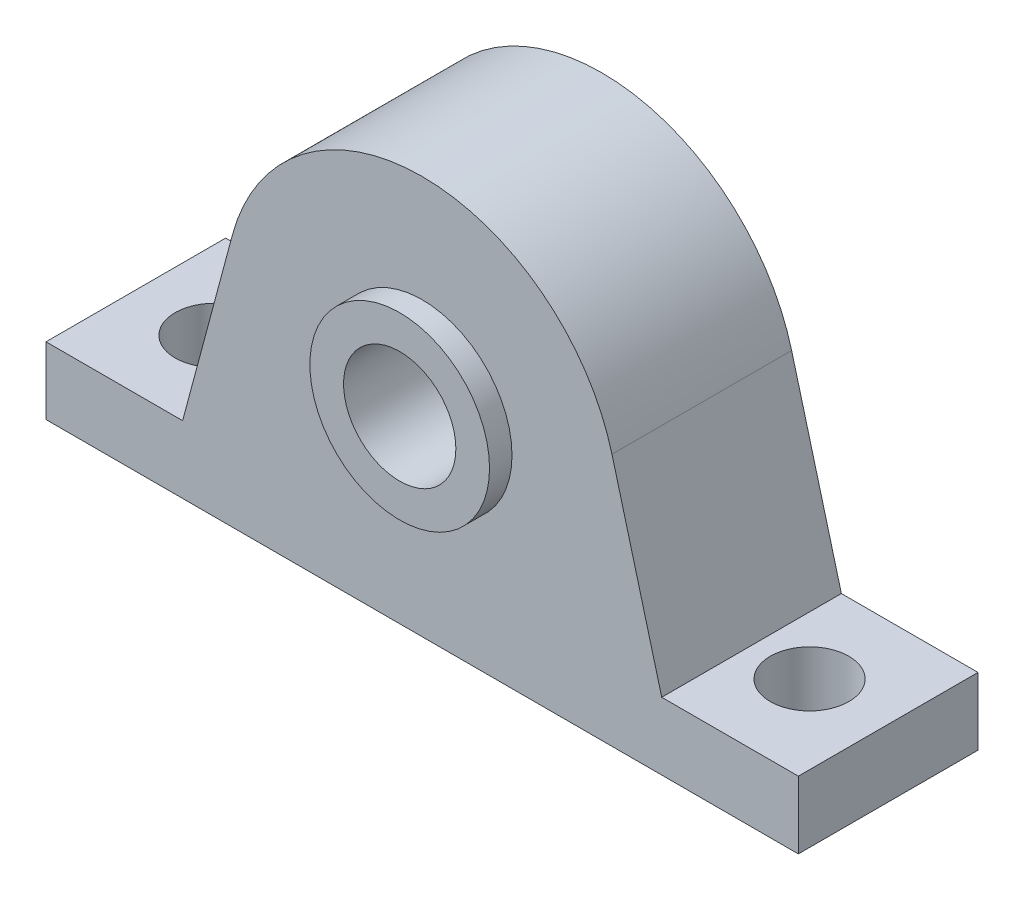
ISO-10303-21;
HEADER;
FILE_DESCRIPTION(('STEP AP214'),'2;1');
FILE_NAME('part.step','',(''),(''),'','','');
FILE_SCHEMA(('AUTOMOTIVE_DESIGN { 1 0 10303 214 1 1 1 1 }'));
ENDSEC;
DATA;
#1=APPLICATION_CONTEXT('core data for automotive mechanical design processes');
#2=APPLICATION_PROTOCOL_DEFINITION('international standard','automotive_design',2000,#1);
#3=PRODUCT_CONTEXT('',#1,'mechanical');
#4=PRODUCT('Part','Part','',(#3));
#5=PRODUCT_RELATED_PRODUCT_CATEGORY('part','',(#4));
#6=PRODUCT_DEFINITION_FORMATION('','',#4);
#7=PRODUCT_DEFINITION_CONTEXT('part definition',#1,'design');
#8=PRODUCT_DEFINITION('design','',#6,#7);
#9=PRODUCT_DEFINITION_SHAPE('','',#8);
#10=(LENGTH_UNIT() NAMED_UNIT(*) SI_UNIT(.MILLI.,.METRE.));
#11=(NAMED_UNIT(*) PLANE_ANGLE_UNIT() SI_UNIT($,.RADIAN.));
#12=(NAMED_UNIT(*) SI_UNIT($,.STERADIAN.) SOLID_ANGLE_UNIT());
#13=UNCERTAINTY_MEASURE_WITH_UNIT(LENGTH_MEASURE(1.E-05),#10,'distance_accuracy_value','');
#14=(GEOMETRIC_REPRESENTATION_CONTEXT(3) GLOBAL_UNCERTAINTY_ASSIGNED_CONTEXT((#13)) GLOBAL_UNIT_ASSIGNED_CONTEXT((#10,
#11,#12)) REPRESENTATION_CONTEXT('',''));
#15=CARTESIAN_POINT('',(0.,0.,0.));
#16=DIRECTION('',(0.,0.,1.));
#17=DIRECTION('',(1.,0.,0.));
#18=AXIS2_PLACEMENT_3D('',#15,#16,#17);
#19=CARTESIAN_POINT('',(0.,0.,16.));
#20=DIRECTION('',(0.,0.,1.));
#21=DIRECTION('',(1.,0.,0.));
#22=AXIS2_PLACEMENT_3D('',#19,#20,#21);
#23=PLANE('',#22);
#24=DIRECTION('',(-0.258819045102518,0.965925826289069,0.));
#25=VECTOR('',#24,1.);
#26=CARTESIAN_POINT('',(21.4037019600587,5.7351046552341,16.));
#27=LINE('',#26,#25);
#28=CARTESIAN_POINT('',(21.3327234663499,6.00000000000001,16.));
#29=VERTEX_POINT('',#28);
#30=CARTESIAN_POINT('',(16.9037019600587,22.5293332892941,16.));
#31=VERTEX_POINT('',#30);
#32=EDGE_CURVE('E163',#29,#31,#27,.T.);
#33=ORIENTED_EDGE('',*,*,#32,.T.);
#34=CARTESIAN_POINT('',(0.,18.,16.));
#35=DIRECTION('',(0.,0.,1.));
#36=DIRECTION('',(1.,0.,0.));
#37=AXIS2_PLACEMENT_3D('',#34,#35,#36);
#38=CIRCLE('',#37,17.5);
#39=CARTESIAN_POINT('',(-16.9037019600587,22.5293332892941,16.));
#40=VERTEX_POINT('',#39);
#41=EDGE_CURVE('E104',#31,#40,#38,.T.);
#42=ORIENTED_EDGE('',*,*,#41,.T.);
#43=DIRECTION('',(0.258819045102518,0.965925826289069,0.));
#44=VECTOR('',#43,1.);
#45=CARTESIAN_POINT('',(-21.4037019600587,5.73510465523409,16.));
#46=LINE('',#45,#44);
#47=CARTESIAN_POINT('',(-21.3327234663499,6.,16.));
#48=VERTEX_POINT('',#47);
#49=EDGE_CURVE('E176',#48,#40,#46,.T.);
#50=ORIENTED_EDGE('',*,*,#49,.F.);
#51=DIRECTION('',(1.,0.,0.));
#52=VECTOR('',#51,1.);
#53=CARTESIAN_POINT('',(0.,6.,16.));
#54=LINE('',#53,#52);
#55=CARTESIAN_POINT('',(-33.5,6.,16.));
#56=VERTEX_POINT('',#55);
#57=EDGE_CURVE('E188',#56,#48,#54,.T.);
#58=ORIENTED_EDGE('',*,*,#57,.F.);
#59=DIRECTION('',(0.,1.,0.));
#60=VECTOR('',#59,1.);
#61=CARTESIAN_POINT('',(-33.5,0.,16.));
#62=LINE('',#61,#60);
#63=CARTESIAN_POINT('',(-33.5,0.,16.));
#64=VERTEX_POINT('',#63);
#65=EDGE_CURVE('E125',#64,#56,#62,.T.);
#66=ORIENTED_EDGE('',*,*,#65,.F.);
#67=DIRECTION('',(1.,0.,0.));
#68=VECTOR('',#67,1.);
#69=CARTESIAN_POINT('',(0.,0.,16.));
#70=LINE('',#69,#68);
#71=CARTESIAN_POINT('',(33.5,0.,16.));
#72=VERTEX_POINT('',#71);
#73=EDGE_CURVE('E118',#64,#72,#70,.T.);
#74=ORIENTED_EDGE('',*,*,#73,.T.);
#75=DIRECTION('',(0.,1.,0.));
#76=VECTOR('',#75,1.);
#77=CARTESIAN_POINT('',(33.5,0.,16.));
#78=LINE('',#77,#76);
#79=CARTESIAN_POINT('',(33.5,6.00000000000001,16.));
#80=VERTEX_POINT('',#79);
#81=EDGE_CURVE('E122',#72,#80,#78,.T.);
#82=ORIENTED_EDGE('',*,*,#81,.T.);
#83=DIRECTION('',(-1.,0.,0.));
#84=VECTOR('',#83,1.);
#85=CARTESIAN_POINT('',(0.,6.,16.));
#86=LINE('',#85,#84);
#87=EDGE_CURVE('E61',#80,#29,#86,.T.);
#88=ORIENTED_EDGE('',*,*,#87,.T.);
#89=EDGE_LOOP('',(#33,#42,#50,#58,#66,#74,#82,#88));
#90=FACE_BOUND('',#89,.T.);
#91=CARTESIAN_POINT('',(0.,18.,16.));
#92=DIRECTION('',(0.,0.,1.));
#93=DIRECTION('',(1.,0.,0.));
#94=AXIS2_PLACEMENT_3D('',#91,#92,#93);
#95=CIRCLE('',#94,8.);
#96=CARTESIAN_POINT('',(8.,18.,16.));
#97=VERTEX_POINT('',#96);
#98=EDGE_CURVE('E252',#97,#97,#95,.T.);
#99=ORIENTED_EDGE('',*,*,#98,.F.);
#100=EDGE_LOOP('',(#99));
#101=FACE_BOUND('',#100,.T.);
#102=ADVANCED_FACE('F43',(#90,#101),#23,.T.);
#103=CARTESIAN_POINT('',(21.4037019600587,5.7351046552341,16.));
#104=DIRECTION('',(-0.965925826289069,-0.258819045102518,0.));
#105=DIRECTION('',(0.258819045102518,-0.965925826289069,0.));
#106=AXIS2_PLACEMENT_3D('',#103,#104,#105);
#107=PLANE('',#106);
#108=DIRECTION('',(-0.258819045102518,0.965925826289069,0.));
#109=VECTOR('',#108,1.);
#110=CARTESIAN_POINT('',(21.4037019600587,5.7351046552341,0.));
#111=LINE('',#110,#109);
#112=CARTESIAN_POINT('',(21.3327234663499,6.00000000000001,0.));
#113=VERTEX_POINT('',#112);
#114=CARTESIAN_POINT('',(16.9037019600587,22.5293332892941,0.));
#115=VERTEX_POINT('',#114);
#116=EDGE_CURVE('E141',#113,#115,#111,.T.);
#117=ORIENTED_EDGE('',*,*,#116,.T.);
#118=DIRECTION('',(0.,0.,-1.));
#119=VECTOR('',#118,1.);
#120=CARTESIAN_POINT('',(16.9037019600587,22.5293332892941,16.));
#121=LINE('',#120,#119);
#122=EDGE_CURVE('E11',#31,#115,#121,.T.);
#123=ORIENTED_EDGE('',*,*,#122,.F.);
#124=ORIENTED_EDGE('',*,*,#32,.F.);
#125=DIRECTION('',(0.,0.,-1.));
#126=VECTOR('',#125,1.);
#127=CARTESIAN_POINT('',(21.3327234663499,6.00000000000001,16.));
#128=LINE('',#127,#126);
#129=EDGE_CURVE('E137',#29,#113,#128,.T.);
#130=ORIENTED_EDGE('',*,*,#129,.T.);
#131=EDGE_LOOP('',(#117,#123,#124,#130));
#132=FACE_BOUND('',#131,.T.);
#133=ADVANCED_FACE('F45',(#132),#107,.F.);
#134=CARTESIAN_POINT('',(0.,18.,16.));
#135=DIRECTION('',(0.,0.,-1.));
#136=DIRECTION('',(-1.,0.,0.));
#137=AXIS2_PLACEMENT_3D('',#134,#135,#136);
#138=CYLINDRICAL_SURFACE('',#137,17.5);
#139=CARTESIAN_POINT('',(0.,18.,0.));
#140=DIRECTION('',(0.,0.,1.));
#141=DIRECTION('',(1.,0.,0.));
#142=AXIS2_PLACEMENT_3D('',#139,#140,#141);
#143=CIRCLE('',#142,17.5);
#144=CARTESIAN_POINT('',(-16.9037019600587,22.5293332892941,0.));
#145=VERTEX_POINT('',#144);
#146=EDGE_CURVE('E144',#115,#145,#143,.T.);
#147=ORIENTED_EDGE('',*,*,#146,.T.);
#148=DIRECTION('',(0.,0.,-1.));
#149=VECTOR('',#148,1.);
#150=CARTESIAN_POINT('',(-16.9037019600587,22.5293332892941,16.));
#151=LINE('',#150,#149);
#152=EDGE_CURVE('E53',#40,#145,#151,.T.);
#153=ORIENTED_EDGE('',*,*,#152,.F.);
#154=ORIENTED_EDGE('',*,*,#41,.F.);
#155=ORIENTED_EDGE('',*,*,#122,.T.);
#156=EDGE_LOOP('',(#147,#153,#154,#155));
#157=FACE_BOUND('',#156,.T.);
#158=ADVANCED_FACE('F177',(#157),#138,.T.);
#159=CARTESIAN_POINT('',(-21.4037019600587,5.73510465523409,16.));
#160=DIRECTION('',(-0.965925826289069,0.258819045102518,0.));
#161=DIRECTION('',(-0.258819045102518,-0.965925826289069,0.));
#162=AXIS2_PLACEMENT_3D('',#159,#160,#161);
#163=PLANE('',#162);
#164=DIRECTION('',(0.258819045102518,0.965925826289069,0.));
#165=VECTOR('',#164,1.);
#166=CARTESIAN_POINT('',(-21.4037019600587,5.73510465523409,0.));
#167=LINE('',#166,#165);
#168=CARTESIAN_POINT('',(-21.3327234663499,6.,0.));
#169=VERTEX_POINT('',#168);
#170=EDGE_CURVE('E148',#169,#145,#167,.T.);
#171=ORIENTED_EDGE('',*,*,#170,.F.);
#172=DIRECTION('',(0.,0.,-1.));
#173=VECTOR('',#172,1.);
#174=CARTESIAN_POINT('',(-21.3327234663499,6.,16.));
#175=LINE('',#174,#173);
#176=EDGE_CURVE('E169',#48,#169,#175,.T.);
#177=ORIENTED_EDGE('',*,*,#176,.F.);
#178=ORIENTED_EDGE('',*,*,#49,.T.);
#179=ORIENTED_EDGE('',*,*,#152,.T.);
#180=EDGE_LOOP('',(#171,#177,#178,#179));
#181=FACE_BOUND('',#180,.T.);
#182=ADVANCED_FACE('F174',(#181),#163,.T.);
#183=CARTESIAN_POINT('',(0.,6.,16.));
#184=DIRECTION('',(0.,1.,0.));
#185=DIRECTION('',(0.,0.,1.));
#186=AXIS2_PLACEMENT_3D('',#183,#184,#185);
#187=PLANE('',#186);
#188=CARTESIAN_POINT('',(-26.5,6.,8.));
#189=DIRECTION('',(0.,1.,0.));
#190=DIRECTION('',(0.,0.,1.));
#191=AXIS2_PLACEMENT_3D('',#188,#189,#190);
#192=CIRCLE('',#191,3.5);
#193=CARTESIAN_POINT('',(-26.5,6.,11.5));
#194=VERTEX_POINT('',#193);
#195=EDGE_CURVE('E245',#194,#194,#192,.T.);
#196=ORIENTED_EDGE('',*,*,#195,.F.);
#197=EDGE_LOOP('',(#196));
#198=FACE_BOUND('',#197,.T.);
#199=DIRECTION('',(1.,0.,0.));
#200=VECTOR('',#199,1.);
#201=CARTESIAN_POINT('',(0.,6.,0.));
#202=LINE('',#201,#200);
#203=CARTESIAN_POINT('',(-33.5,6.,0.));
#204=VERTEX_POINT('',#203);
#205=EDGE_CURVE('E151',#204,#169,#202,.T.);
#206=ORIENTED_EDGE('',*,*,#205,.F.);
#207=DIRECTION('',(0.,0.,-1.));
#208=VECTOR('',#207,1.);
#209=CARTESIAN_POINT('',(-33.5,6.,16.));
#210=LINE('',#209,#208);
#211=EDGE_CURVE('E167',#56,#204,#210,.T.);
#212=ORIENTED_EDGE('',*,*,#211,.F.);
#213=ORIENTED_EDGE('',*,*,#57,.T.);
#214=ORIENTED_EDGE('',*,*,#176,.T.);
#215=EDGE_LOOP('',(#206,#212,#213,#214));
#216=FACE_BOUND('',#215,.T.);
#217=ADVANCED_FACE('F186',(#198,#216),#187,.T.);
#218=CARTESIAN_POINT('',(-33.5,0.,16.));
#219=DIRECTION('',(-1.,0.,0.));
#220=DIRECTION('',(0.,0.,1.));
#221=AXIS2_PLACEMENT_3D('',#218,#219,#220);
#222=PLANE('',#221);
#223=DIRECTION('',(0.,1.,0.));
#224=VECTOR('',#223,1.);
#225=CARTESIAN_POINT('',(-33.5,0.,0.));
#226=LINE('',#225,#224);
#227=CARTESIAN_POINT('',(-33.5,0.,0.));
#228=VERTEX_POINT('',#227);
#229=EDGE_CURVE('E154',#228,#204,#226,.T.);
#230=ORIENTED_EDGE('',*,*,#229,.F.);
#231=DIRECTION('',(0.,0.,-1.));
#232=VECTOR('',#231,1.);
#233=CARTESIAN_POINT('',(-33.5,0.,16.));
#234=LINE('',#233,#232);
#235=EDGE_CURVE('E132',#64,#228,#234,.T.);
#236=ORIENTED_EDGE('',*,*,#235,.F.);
#237=ORIENTED_EDGE('',*,*,#65,.T.);
#238=ORIENTED_EDGE('',*,*,#211,.T.);
#239=EDGE_LOOP('',(#230,#236,#237,#238));
#240=FACE_BOUND('',#239,.T.);
#241=ADVANCED_FACE('F194',(#240),#222,.T.);
#242=CARTESIAN_POINT('',(0.,0.,16.));
#243=DIRECTION('',(0.,1.,0.));
#244=DIRECTION('',(-1.,0.,0.));
#245=AXIS2_PLACEMENT_3D('',#242,#243,#244);
#246=PLANE('',#245);
#247=CARTESIAN_POINT('',(-26.5,0.,8.));
#248=DIRECTION('',(0.,1.,0.));
#249=DIRECTION('',(-1.,0.,0.));
#250=AXIS2_PLACEMENT_3D('',#247,#248,#249);
#251=CIRCLE('',#250,3.5);
#252=CARTESIAN_POINT('',(-30.,0.,8.));
#253=VERTEX_POINT('',#252);
#254=EDGE_CURVE('E47',#253,#253,#251,.T.);
#255=ORIENTED_EDGE('',*,*,#254,.T.);
#256=EDGE_LOOP('',(#255));
#257=FACE_BOUND('',#256,.T.);
#258=CARTESIAN_POINT('',(26.5,0.,7.99999999999999));
#259=DIRECTION('',(0.,1.,0.));
#260=DIRECTION('',(-1.,0.,0.));
#261=AXIS2_PLACEMENT_3D('',#258,#259,#260);
#262=CIRCLE('',#261,3.5);
#263=CARTESIAN_POINT('',(23.,0.,7.99999999999999));
#264=VERTEX_POINT('',#263);
#265=EDGE_CURVE('E250',#264,#264,#262,.T.);
#266=ORIENTED_EDGE('',*,*,#265,.T.);
#267=EDGE_LOOP('',(#266));
#268=FACE_BOUND('',#267,.T.);
#269=DIRECTION('',(1.,0.,0.));
#270=VECTOR('',#269,1.);
#271=CARTESIAN_POINT('',(0.,0.,0.));
#272=LINE('',#271,#270);
#273=CARTESIAN_POINT('',(33.5,0.,0.));
#274=VERTEX_POINT('',#273);
#275=EDGE_CURVE('E131',#228,#274,#272,.T.);
#276=ORIENTED_EDGE('',*,*,#275,.T.);
#277=DIRECTION('',(0.,0.,-1.));
#278=VECTOR('',#277,1.);
#279=CARTESIAN_POINT('',(33.5,0.,16.));
#280=LINE('',#279,#278);
#281=EDGE_CURVE('E128',#72,#274,#280,.T.);
#282=ORIENTED_EDGE('',*,*,#281,.F.);
#283=ORIENTED_EDGE('',*,*,#73,.F.);
#284=ORIENTED_EDGE('',*,*,#235,.T.);
#285=EDGE_LOOP('',(#276,#282,#283,#284));
#286=FACE_BOUND('',#285,.T.);
#287=ADVANCED_FACE('F129',(#257,#268,#286),#246,.F.);
#288=CARTESIAN_POINT('',(33.5,0.,16.));
#289=DIRECTION('',(-1.,0.,0.));
#290=DIRECTION('',(0.,-1.,0.));
#291=AXIS2_PLACEMENT_3D('',#288,#289,#290);
#292=PLANE('',#291);
#293=DIRECTION('',(0.,1.,0.));
#294=VECTOR('',#293,1.);
#295=CARTESIAN_POINT('',(33.5,0.,0.));
#296=LINE('',#295,#294);
#297=CARTESIAN_POINT('',(33.5,6.00000000000001,0.));
#298=VERTEX_POINT('',#297);
#299=EDGE_CURVE('E90',#274,#298,#296,.T.);
#300=ORIENTED_EDGE('',*,*,#299,.T.);
#301=DIRECTION('',(0.,0.,-1.));
#302=VECTOR('',#301,1.);
#303=CARTESIAN_POINT('',(33.5,6.00000000000001,16.));
#304=LINE('',#303,#302);
#305=EDGE_CURVE('E133',#80,#298,#304,.T.);
#306=ORIENTED_EDGE('',*,*,#305,.F.);
#307=ORIENTED_EDGE('',*,*,#81,.F.);
#308=ORIENTED_EDGE('',*,*,#281,.T.);
#309=EDGE_LOOP('',(#300,#306,#307,#308));
#310=FACE_BOUND('',#309,.T.);
#311=ADVANCED_FACE('F135',(#310),#292,.F.);
#312=CARTESIAN_POINT('',(0.,6.,16.));
#313=DIRECTION('',(0.,-1.,0.));
#314=DIRECTION('',(1.,0.,0.));
#315=AXIS2_PLACEMENT_3D('',#312,#313,#314);
#316=PLANE('',#315);
#317=CARTESIAN_POINT('',(26.5,6.,7.99999999999999));
#318=DIRECTION('',(0.,1.,0.));
#319=DIRECTION('',(0.,0.,-1.));
#320=AXIS2_PLACEMENT_3D('',#317,#318,#319);
#321=CIRCLE('',#320,3.5);
#322=CARTESIAN_POINT('',(26.5,6.,4.49999999999999));
#323=VERTEX_POINT('',#322);
#324=EDGE_CURVE('E258',#323,#323,#321,.T.);
#325=ORIENTED_EDGE('',*,*,#324,.F.);
#326=EDGE_LOOP('',(#325));
#327=FACE_BOUND('',#326,.T.);
#328=DIRECTION('',(-1.,0.,0.));
#329=VECTOR('',#328,1.);
#330=CARTESIAN_POINT('',(0.,6.,0.));
#331=LINE('',#330,#329);
#332=EDGE_CURVE('E96',#298,#113,#331,.T.);
#333=ORIENTED_EDGE('',*,*,#332,.T.);
#334=ORIENTED_EDGE('',*,*,#129,.F.);
#335=ORIENTED_EDGE('',*,*,#87,.F.);
#336=ORIENTED_EDGE('',*,*,#305,.T.);
#337=EDGE_LOOP('',(#333,#334,#335,#336));
#338=FACE_BOUND('',#337,.T.);
#339=ADVANCED_FACE('F197',(#327,#338),#316,.F.);
#340=CARTESIAN_POINT('',(0.,18.,16.));
#341=DIRECTION('',(0.,0.,-1.));
#342=DIRECTION('',(-1.,0.,0.));
#343=AXIS2_PLACEMENT_3D('',#340,#341,#342);
#344=CYLINDRICAL_SURFACE('',#343,5.);
#345=CARTESIAN_POINT('',(0.,18.,0.));
#346=DIRECTION('',(0.,0.,1.));
#347=DIRECTION('',(1.,0.,0.));
#348=AXIS2_PLACEMENT_3D('',#345,#346,#347);
#349=CIRCLE('',#348,5.);
#350=CARTESIAN_POINT('',(5.,18.,0.));
#351=VERTEX_POINT('',#350);
#352=EDGE_CURVE('E160',#351,#351,#349,.T.);
#353=ORIENTED_EDGE('',*,*,#352,.F.);
#354=EDGE_LOOP('',(#353));
#355=FACE_BOUND('',#354,.T.);
#356=CARTESIAN_POINT('',(0.,18.,18.));
#357=DIRECTION('',(0.,0.,1.));
#358=DIRECTION('',(1.,0.,0.));
#359=AXIS2_PLACEMENT_3D('',#356,#357,#358);
#360=CIRCLE('',#359,5.);
#361=CARTESIAN_POINT('',(5.,18.,18.));
#362=VERTEX_POINT('',#361);
#363=EDGE_CURVE('E249',#362,#362,#360,.T.);
#364=ORIENTED_EDGE('',*,*,#363,.T.);
#365=EDGE_LOOP('',(#364));
#366=FACE_BOUND('',#365,.T.);
#367=ADVANCED_FACE('F199',(#355,#366),#344,.F.);
#368=CARTESIAN_POINT('',(0.,0.,0.));
#369=DIRECTION('',(0.,0.,1.));
#370=DIRECTION('',(1.,0.,0.));
#371=AXIS2_PLACEMENT_3D('',#368,#369,#370);
#372=PLANE('',#371);
#373=ORIENTED_EDGE('',*,*,#116,.F.);
#374=ORIENTED_EDGE('',*,*,#332,.F.);
#375=ORIENTED_EDGE('',*,*,#299,.F.);
#376=ORIENTED_EDGE('',*,*,#275,.F.);
#377=ORIENTED_EDGE('',*,*,#229,.T.);
#378=ORIENTED_EDGE('',*,*,#205,.T.);
#379=ORIENTED_EDGE('',*,*,#170,.T.);
#380=ORIENTED_EDGE('',*,*,#146,.F.);
#381=EDGE_LOOP('',(#373,#374,#375,#376,#377,#378,#379,#380));
#382=FACE_BOUND('',#381,.T.);
#383=ORIENTED_EDGE('',*,*,#352,.T.);
#384=EDGE_LOOP('',(#383));
#385=FACE_BOUND('',#384,.T.);
#386=ADVANCED_FACE('F181',(#382,#385),#372,.F.);
#387=CARTESIAN_POINT('',(0.,18.,18.));
#388=DIRECTION('',(0.,0.,1.));
#389=DIRECTION('',(1.,0.,0.));
#390=AXIS2_PLACEMENT_3D('',#387,#388,#389);
#391=PLANE('',#390);
#392=CARTESIAN_POINT('',(0.,18.,18.));
#393=DIRECTION('',(0.,0.,1.));
#394=DIRECTION('',(1.,0.,0.));
#395=AXIS2_PLACEMENT_3D('',#392,#393,#394);
#396=CIRCLE('',#395,8.);
#397=CARTESIAN_POINT('',(8.,18.,18.));
#398=VERTEX_POINT('',#397);
#399=EDGE_CURVE('E145',#398,#398,#396,.T.);
#400=ORIENTED_EDGE('',*,*,#399,.T.);
#401=EDGE_LOOP('',(#400));
#402=FACE_BOUND('',#401,.T.);
#403=ORIENTED_EDGE('',*,*,#363,.F.);
#404=EDGE_LOOP('',(#403));
#405=FACE_BOUND('',#404,.T.);
#406=ADVANCED_FACE('F222',(#402,#405),#391,.T.);
#407=CARTESIAN_POINT('',(0.,18.,18.));
#408=DIRECTION('',(0.,0.,-1.));
#409=DIRECTION('',(-1.,0.,0.));
#410=AXIS2_PLACEMENT_3D('',#407,#408,#409);
#411=CYLINDRICAL_SURFACE('',#410,8.);
#412=ORIENTED_EDGE('',*,*,#399,.F.);
#413=EDGE_LOOP('',(#412));
#414=FACE_BOUND('',#413,.T.);
#415=ORIENTED_EDGE('',*,*,#98,.T.);
#416=EDGE_LOOP('',(#415));
#417=FACE_BOUND('',#416,.T.);
#418=ADVANCED_FACE('F220',(#414,#417),#411,.T.);
#419=CARTESIAN_POINT('',(26.5,-6.,7.99999999999999));
#420=DIRECTION('',(0.,1.,0.));
#421=DIRECTION('',(0.,0.,1.));
#422=AXIS2_PLACEMENT_3D('',#419,#420,#421);
#423=CYLINDRICAL_SURFACE('',#422,3.5);
#424=ORIENTED_EDGE('',*,*,#324,.T.);
#425=EDGE_LOOP('',(#424));
#426=FACE_BOUND('',#425,.T.);
#427=ORIENTED_EDGE('',*,*,#265,.F.);
#428=EDGE_LOOP('',(#427));
#429=FACE_BOUND('',#428,.T.);
#430=ADVANCED_FACE('F230',(#426,#429),#423,.F.);
#431=CARTESIAN_POINT('',(-26.5,-6.,8.));
#432=DIRECTION('',(0.,1.,0.));
#433=DIRECTION('',(0.,0.,1.));
#434=AXIS2_PLACEMENT_3D('',#431,#432,#433);
#435=CYLINDRICAL_SURFACE('',#434,3.5);
#436=ORIENTED_EDGE('',*,*,#195,.T.);
#437=EDGE_LOOP('',(#436));
#438=FACE_BOUND('',#437,.T.);
#439=ORIENTED_EDGE('',*,*,#254,.F.);
#440=EDGE_LOOP('',(#439));
#441=FACE_BOUND('',#440,.T.);
#442=ADVANCED_FACE('F236',(#438,#441),#435,.F.);
#443=CLOSED_SHELL('',(#102,#133,#158,#182,#217,#241,#287,#311,#339,#367,#386,#406,#418,#430,#442));
#444=MANIFOLD_SOLID_BREP('B2',#443);
#445=ADVANCED_BREP_SHAPE_REPRESENTATION('',(#18,#444),#14);
#446=SHAPE_DEFINITION_REPRESENTATION(#9,#445);
ENDSEC;
END-ISO-10303-21;
